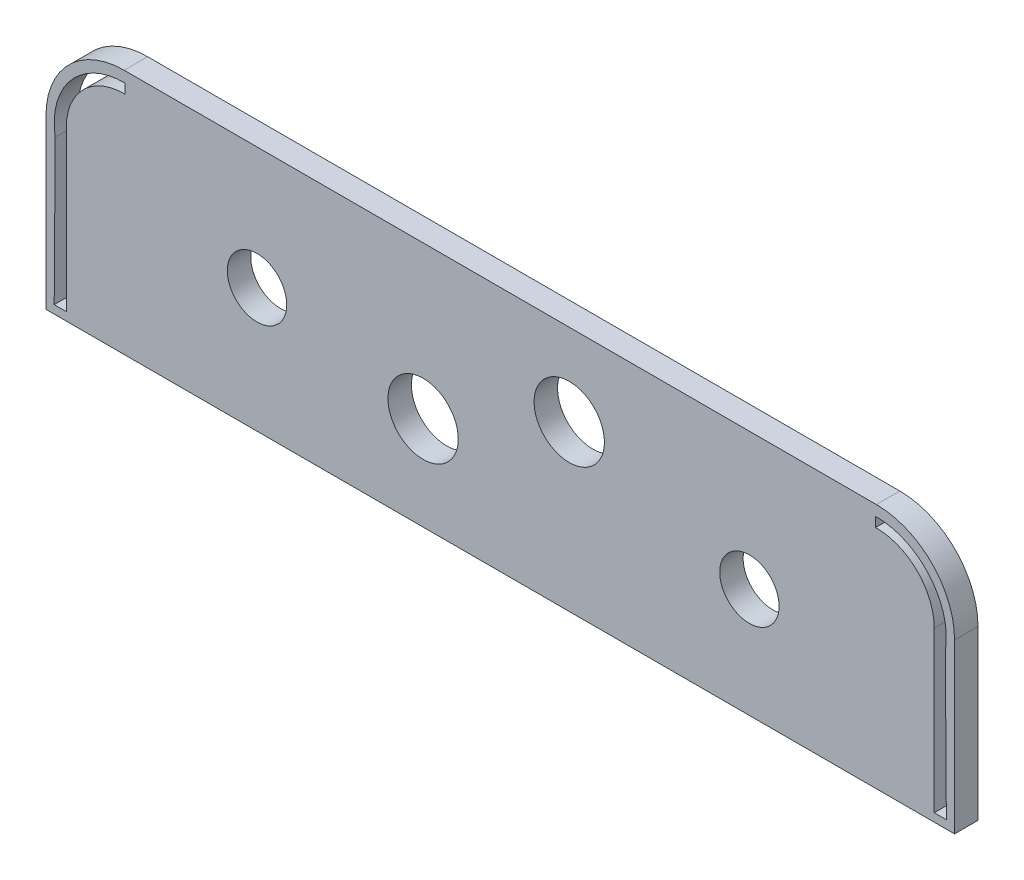
ISO-10303-21;
HEADER;
FILE_DESCRIPTION(('STEP AP214'),'2;1');
FILE_NAME('part.step','',(''),(''),'','','');
FILE_SCHEMA(('AUTOMOTIVE_DESIGN { 1 0 10303 214 1 1 1 1 }'));
ENDSEC;
DATA;
#1=APPLICATION_CONTEXT('core data for automotive mechanical design processes');
#2=APPLICATION_PROTOCOL_DEFINITION('international standard','automotive_design',2000,#1);
#3=PRODUCT_CONTEXT('',#1,'mechanical');
#4=PRODUCT('Part','Part','',(#3));
#5=PRODUCT_RELATED_PRODUCT_CATEGORY('part','',(#4));
#6=PRODUCT_DEFINITION_FORMATION('','',#4);
#7=PRODUCT_DEFINITION_CONTEXT('part definition',#1,'design');
#8=PRODUCT_DEFINITION('design','',#6,#7);
#9=PRODUCT_DEFINITION_SHAPE('','',#8);
#10=(LENGTH_UNIT() NAMED_UNIT(*) SI_UNIT(.MILLI.,.METRE.));
#11=(NAMED_UNIT(*) PLANE_ANGLE_UNIT() SI_UNIT($,.RADIAN.));
#12=(NAMED_UNIT(*) SI_UNIT($,.STERADIAN.) SOLID_ANGLE_UNIT());
#13=UNCERTAINTY_MEASURE_WITH_UNIT(LENGTH_MEASURE(1.E-05),#10,'distance_accuracy_value','');
#14=(GEOMETRIC_REPRESENTATION_CONTEXT(3) GLOBAL_UNCERTAINTY_ASSIGNED_CONTEXT((#13)) GLOBAL_UNIT_ASSIGNED_CONTEXT((#10,
#11,#12)) REPRESENTATION_CONTEXT('',''));
#15=CARTESIAN_POINT('',(0.,0.,0.));
#16=DIRECTION('',(0.,0.,1.));
#17=DIRECTION('',(1.,0.,0.));
#18=AXIS2_PLACEMENT_3D('',#15,#16,#17);
#19=CARTESIAN_POINT('',(58.125,5.75,3.));
#20=DIRECTION('',(-1.,0.,0.));
#21=DIRECTION('',(0.,-1.,0.));
#22=AXIS2_PLACEMENT_3D('',#19,#20,#21);
#23=PLANE('',#22);
#24=DIRECTION('',(0.,-1.,0.));
#25=VECTOR('',#24,1.);
#26=CARTESIAN_POINT('',(58.125,-15.75,3.));
#27=LINE('',#26,#25);
#28=CARTESIAN_POINT('',(58.125,5.74999999999999,3.));
#29=VERTEX_POINT('',#28);
#30=CARTESIAN_POINT('',(58.125,-15.75,3.));
#31=VERTEX_POINT('',#30);
#32=EDGE_CURVE('E365',#29,#31,#27,.T.);
#33=ORIENTED_EDGE('',*,*,#32,.T.);
#34=DIRECTION('',(0.,0.,-1.));
#35=VECTOR('',#34,1.);
#36=CARTESIAN_POINT('',(58.125,-15.75,3.));
#37=LINE('',#36,#35);
#38=CARTESIAN_POINT('',(58.125,-15.75,0.));
#39=VERTEX_POINT('',#38);
#40=EDGE_CURVE('E265',#31,#39,#37,.T.);
#41=ORIENTED_EDGE('',*,*,#40,.T.);
#42=DIRECTION('',(0.,1.,0.));
#43=VECTOR('',#42,1.);
#44=CARTESIAN_POINT('',(58.125,5.75,0.));
#45=LINE('',#44,#43);
#46=CARTESIAN_POINT('',(58.125,5.75,0.));
#47=VERTEX_POINT('',#46);
#48=EDGE_CURVE('E256',#39,#47,#45,.T.);
#49=ORIENTED_EDGE('',*,*,#48,.T.);
#50=DIRECTION('',(0.,0.,-1.));
#51=VECTOR('',#50,1.);
#52=CARTESIAN_POINT('',(58.125,5.75,3.));
#53=LINE('',#52,#51);
#54=EDGE_CURVE('E291',#29,#47,#53,.T.);
#55=ORIENTED_EDGE('',*,*,#54,.F.);
#56=EDGE_LOOP('',(#33,#41,#49,#55));
#57=FACE_BOUND('',#56,.T.);
#58=ADVANCED_FACE('F41',(#57),#23,.F.);
#59=CARTESIAN_POINT('',(48.125,5.75,3.));
#60=DIRECTION('',(0.,0.,-1.));
#61=DIRECTION('',(-1.,0.,0.));
#62=AXIS2_PLACEMENT_3D('',#59,#60,#61);
#63=CYLINDRICAL_SURFACE('',#62,10.);
#64=CARTESIAN_POINT('',(48.125,5.75,3.));
#65=DIRECTION('',(0.,0.,1.));
#66=DIRECTION('',(1.,0.,0.));
#67=AXIS2_PLACEMENT_3D('',#64,#65,#66);
#68=CIRCLE('',#67,10.);
#69=CARTESIAN_POINT('',(48.125,15.75,3.));
#70=VERTEX_POINT('',#69);
#71=EDGE_CURVE('E187',#70,#29,#68,.F.);
#72=ORIENTED_EDGE('',*,*,#71,.T.);
#73=ORIENTED_EDGE('',*,*,#54,.T.);
#74=CARTESIAN_POINT('',(48.125,5.75,0.));
#75=DIRECTION('',(0.,0.,1.));
#76=DIRECTION('',(-1.,0.,0.));
#77=AXIS2_PLACEMENT_3D('',#74,#75,#76);
#78=CIRCLE('',#77,10.);
#79=CARTESIAN_POINT('',(48.125,15.75,0.));
#80=VERTEX_POINT('',#79);
#81=EDGE_CURVE('E268',#47,#80,#78,.T.);
#82=ORIENTED_EDGE('',*,*,#81,.T.);
#83=DIRECTION('',(0.,0.,-1.));
#84=VECTOR('',#83,1.);
#85=CARTESIAN_POINT('',(48.125,15.75,3.));
#86=LINE('',#85,#84);
#87=EDGE_CURVE('E288',#70,#80,#86,.T.);
#88=ORIENTED_EDGE('',*,*,#87,.F.);
#89=EDGE_LOOP('',(#72,#73,#82,#88));
#90=FACE_BOUND('',#89,.T.);
#91=ADVANCED_FACE('F355',(#90),#63,.T.);
#92=CARTESIAN_POINT('',(-48.125,5.75,3.));
#93=DIRECTION('',(0.,0.,-1.));
#94=DIRECTION('',(-1.,0.,0.));
#95=AXIS2_PLACEMENT_3D('',#92,#93,#94);
#96=CYLINDRICAL_SURFACE('',#95,10.);
#97=CARTESIAN_POINT('',(-48.125,5.75,3.));
#98=DIRECTION('',(0.,0.,1.));
#99=DIRECTION('',(1.,0.,0.));
#100=AXIS2_PLACEMENT_3D('',#97,#98,#99);
#101=CIRCLE('',#100,10.);
#102=CARTESIAN_POINT('',(-58.125,5.75,3.));
#103=VERTEX_POINT('',#102);
#104=CARTESIAN_POINT('',(-48.125,15.75,3.));
#105=VERTEX_POINT('',#104);
#106=EDGE_CURVE('E317',#103,#105,#101,.F.);
#107=ORIENTED_EDGE('',*,*,#106,.T.);
#108=DIRECTION('',(0.,0.,-1.));
#109=VECTOR('',#108,1.);
#110=CARTESIAN_POINT('',(-48.125,15.75,3.));
#111=LINE('',#110,#109);
#112=CARTESIAN_POINT('',(-48.125,15.75,0.));
#113=VERTEX_POINT('',#112);
#114=EDGE_CURVE('E285',#105,#113,#111,.T.);
#115=ORIENTED_EDGE('',*,*,#114,.T.);
#116=CARTESIAN_POINT('',(-48.125,5.75,0.));
#117=DIRECTION('',(0.,0.,1.));
#118=DIRECTION('',(1.,0.,0.));
#119=AXIS2_PLACEMENT_3D('',#116,#117,#118);
#120=CIRCLE('',#119,10.);
#121=CARTESIAN_POINT('',(-58.125,5.75,0.));
#122=VERTEX_POINT('',#121);
#123=EDGE_CURVE('E272',#113,#122,#120,.T.);
#124=ORIENTED_EDGE('',*,*,#123,.T.);
#125=DIRECTION('',(0.,0.,-1.));
#126=VECTOR('',#125,1.);
#127=CARTESIAN_POINT('',(-58.125,5.75,3.));
#128=LINE('',#127,#126);
#129=EDGE_CURVE('E283',#103,#122,#128,.T.);
#130=ORIENTED_EDGE('',*,*,#129,.F.);
#131=EDGE_LOOP('',(#107,#115,#124,#130));
#132=FACE_BOUND('',#131,.T.);
#133=ADVANCED_FACE('F361',(#132),#96,.T.);
#134=CARTESIAN_POINT('',(-58.125,5.75,3.));
#135=DIRECTION('',(1.,0.,0.));
#136=DIRECTION('',(0.,0.,-1.));
#137=AXIS2_PLACEMENT_3D('',#134,#135,#136);
#138=PLANE('',#137);
#139=DIRECTION('',(0.,1.,0.));
#140=VECTOR('',#139,1.);
#141=CARTESIAN_POINT('',(-58.125,5.75,3.));
#142=LINE('',#141,#140);
#143=CARTESIAN_POINT('',(-58.125,-15.75,3.));
#144=VERTEX_POINT('',#143);
#145=EDGE_CURVE('E391',#144,#103,#142,.T.);
#146=ORIENTED_EDGE('',*,*,#145,.T.);
#147=ORIENTED_EDGE('',*,*,#129,.T.);
#148=DIRECTION('',(0.,-1.,0.));
#149=VECTOR('',#148,1.);
#150=CARTESIAN_POINT('',(-58.125,5.75,0.));
#151=LINE('',#150,#149);
#152=CARTESIAN_POINT('',(-58.125,-15.75,0.));
#153=VERTEX_POINT('',#152);
#154=EDGE_CURVE('E275',#122,#153,#151,.T.);
#155=ORIENTED_EDGE('',*,*,#154,.T.);
#156=DIRECTION('',(0.,0.,-1.));
#157=VECTOR('',#156,1.);
#158=CARTESIAN_POINT('',(-58.125,-15.75,3.));
#159=LINE('',#158,#157);
#160=EDGE_CURVE('E281',#144,#153,#159,.T.);
#161=ORIENTED_EDGE('',*,*,#160,.F.);
#162=EDGE_LOOP('',(#146,#147,#155,#161));
#163=FACE_BOUND('',#162,.T.);
#164=ADVANCED_FACE('F395',(#163),#138,.F.);
#165=CARTESIAN_POINT('',(-58.125,-15.75,3.));
#166=DIRECTION('',(0.,1.,0.));
#167=DIRECTION('',(0.,0.,1.));
#168=AXIS2_PLACEMENT_3D('',#165,#166,#167);
#169=PLANE('',#168);
#170=ORIENTED_EDGE('',*,*,#40,.F.);
#171=DIRECTION('',(1.,0.,0.));
#172=VECTOR('',#171,1.);
#173=CARTESIAN_POINT('',(-58.125,-15.75,3.));
#174=LINE('',#173,#172);
#175=EDGE_CURVE('E262',#144,#31,#174,.T.);
#176=ORIENTED_EDGE('',*,*,#175,.F.);
#177=ORIENTED_EDGE('',*,*,#160,.T.);
#178=DIRECTION('',(1.,0.,0.));
#179=VECTOR('',#178,1.);
#180=CARTESIAN_POINT('',(-58.125,-15.75,0.));
#181=LINE('',#180,#179);
#182=EDGE_CURVE('E263',#153,#39,#181,.T.);
#183=ORIENTED_EDGE('',*,*,#182,.T.);
#184=EDGE_LOOP('',(#170,#176,#177,#183));
#185=FACE_BOUND('',#184,.T.);
#186=ADVANCED_FACE('F370',(#185),#169,.F.);
#187=CARTESIAN_POINT('',(-48.125,5.4351898188413,-22.));
#188=DIRECTION('',(0.,0.,1.));
#189=DIRECTION('',(1.,0.,0.));
#190=AXIS2_PLACEMENT_3D('',#187,#188,#189);
#191=CYLINDRICAL_SURFACE('',#190,8.95);
#192=CARTESIAN_POINT('',(-48.125,5.4351898188413,3.));
#193=DIRECTION('',(0.,0.,1.));
#194=DIRECTION('',(1.,0.,0.));
#195=AXIS2_PLACEMENT_3D('',#192,#193,#194);
#196=CIRCLE('',#195,8.95);
#197=CARTESIAN_POINT('',(-48.025,14.3846311421866,3.));
#198=VERTEX_POINT('',#197);
#199=CARTESIAN_POINT('',(-56.946937757455,3.92657648084162,3.));
#200=VERTEX_POINT('',#199);
#201=EDGE_CURVE('E224',#198,#200,#196,.T.);
#202=ORIENTED_EDGE('',*,*,#201,.T.);
#203=DIRECTION('',(0.,0.,1.));
#204=VECTOR('',#203,1.);
#205=CARTESIAN_POINT('',(-56.946937757455,3.92657648084162,-22.));
#206=LINE('',#205,#204);
#207=CARTESIAN_POINT('',(-56.946937757455,3.92657648084162,0.));
#208=VERTEX_POINT('',#207);
#209=EDGE_CURVE('E193',#208,#200,#206,.T.);
#210=ORIENTED_EDGE('',*,*,#209,.F.);
#211=CARTESIAN_POINT('',(-48.125,5.4351898188413,0.));
#212=DIRECTION('',(0.,0.,1.));
#213=DIRECTION('',(1.,0.,0.));
#214=AXIS2_PLACEMENT_3D('',#211,#212,#213);
#215=CIRCLE('',#214,8.95);
#216=CARTESIAN_POINT('',(-48.025,14.3846311421866,0.));
#217=VERTEX_POINT('',#216);
#218=EDGE_CURVE('E226',#217,#208,#215,.T.);
#219=ORIENTED_EDGE('',*,*,#218,.F.);
#220=DIRECTION('',(0.,0.,1.));
#221=VECTOR('',#220,1.);
#222=CARTESIAN_POINT('',(-48.025,14.3846311421866,-22.));
#223=LINE('',#222,#221);
#224=EDGE_CURVE('E213',#217,#198,#223,.T.);
#225=ORIENTED_EDGE('',*,*,#224,.T.);
#226=EDGE_LOOP('',(#202,#210,#219,#225));
#227=FACE_BOUND('',#226,.T.);
#228=ADVANCED_FACE('F402',(#227),#191,.F.);
#229=CARTESIAN_POINT('',(-55.525,-14.7,-22.));
#230=DIRECTION('',(0.,-1.,0.));
#231=DIRECTION('',(0.,0.,-1.));
#232=AXIS2_PLACEMENT_3D('',#229,#230,#231);
#233=PLANE('',#232);
#234=DIRECTION('',(0.,0.,1.));
#235=VECTOR('',#234,1.);
#236=CARTESIAN_POINT('',(-57.0756936373201,-14.7,-22.));
#237=LINE('',#236,#235);
#238=CARTESIAN_POINT('',(-57.0756936373201,-14.7,0.));
#239=VERTEX_POINT('',#238);
#240=CARTESIAN_POINT('',(-57.0756936373201,-14.7,3.));
#241=VERTEX_POINT('',#240);
#242=EDGE_CURVE('E198',#239,#241,#237,.T.);
#243=ORIENTED_EDGE('',*,*,#242,.T.);
#244=DIRECTION('',(1.,0.,0.));
#245=VECTOR('',#244,1.);
#246=CARTESIAN_POINT('',(-48.125,-14.7,3.));
#247=LINE('',#246,#245);
#248=CARTESIAN_POINT('',(-55.525,-14.7,3.));
#249=VERTEX_POINT('',#248);
#250=EDGE_CURVE('E57',#241,#249,#247,.T.);
#251=ORIENTED_EDGE('',*,*,#250,.T.);
#252=DIRECTION('',(0.,0.,1.));
#253=VECTOR('',#252,1.);
#254=CARTESIAN_POINT('',(-55.525,-14.7,-22.));
#255=LINE('',#254,#253);
#256=CARTESIAN_POINT('',(-55.525,-14.7,0.));
#257=VERTEX_POINT('',#256);
#258=EDGE_CURVE('E204',#257,#249,#255,.T.);
#259=ORIENTED_EDGE('',*,*,#258,.F.);
#260=DIRECTION('',(1.,0.,0.));
#261=VECTOR('',#260,1.);
#262=CARTESIAN_POINT('',(-48.125,-14.7,0.));
#263=LINE('',#262,#261);
#264=EDGE_CURVE('E221',#239,#257,#263,.T.);
#265=ORIENTED_EDGE('',*,*,#264,.F.);
#266=EDGE_LOOP('',(#243,#251,#259,#265));
#267=FACE_BOUND('',#266,.T.);
#268=ADVANCED_FACE('F439',(#267),#233,.F.);
#269=CARTESIAN_POINT('',(-56.946937757455,3.92657648084162,-22.));
#270=DIRECTION('',(-0.999976109650513,0.00691231713860811,0.));
#271=DIRECTION('',(-0.00691231713860811,-0.999976109650513,0.));
#272=AXIS2_PLACEMENT_3D('',#269,#270,#271);
#273=PLANE('',#272);
#274=DIRECTION('',(-0.00691231713860811,-0.999976109650513,0.));
#275=VECTOR('',#274,1.);
#276=CARTESIAN_POINT('',(-57.0756936373201,-14.7,3.));
#277=LINE('',#276,#275);
#278=EDGE_CURVE('E390',#200,#241,#277,.T.);
#279=ORIENTED_EDGE('',*,*,#278,.T.);
#280=ORIENTED_EDGE('',*,*,#242,.F.);
#281=DIRECTION('',(-0.00691231713860811,-0.999976109650513,0.));
#282=VECTOR('',#281,1.);
#283=CARTESIAN_POINT('',(-56.9339124636112,5.81089145131277,0.));
#284=LINE('',#283,#282);
#285=EDGE_CURVE('E217',#208,#239,#284,.T.);
#286=ORIENTED_EDGE('',*,*,#285,.F.);
#287=ORIENTED_EDGE('',*,*,#209,.T.);
#288=EDGE_LOOP('',(#279,#280,#286,#287));
#289=FACE_BOUND('',#288,.T.);
#290=ADVANCED_FACE('F351',(#289),#273,.F.);
#291=CARTESIAN_POINT('',(55.525,-14.7,-22.));
#292=DIRECTION('',(0.,-1.,0.));
#293=DIRECTION('',(0.,0.,-1.));
#294=AXIS2_PLACEMENT_3D('',#291,#292,#293);
#295=PLANE('',#294);
#296=DIRECTION('',(1.,0.,0.));
#297=VECTOR('',#296,1.);
#298=CARTESIAN_POINT('',(-48.125,-14.7,3.));
#299=LINE('',#298,#297);
#300=CARTESIAN_POINT('',(55.525,-14.7,3.));
#301=VERTEX_POINT('',#300);
#302=CARTESIAN_POINT('',(57.0756936373201,-14.7,3.));
#303=VERTEX_POINT('',#302);
#304=EDGE_CURVE('E170',#301,#303,#299,.T.);
#305=ORIENTED_EDGE('',*,*,#304,.T.);
#306=DIRECTION('',(0.,0.,1.));
#307=VECTOR('',#306,1.);
#308=CARTESIAN_POINT('',(57.0756936373201,-14.7,-22.));
#309=LINE('',#308,#307);
#310=CARTESIAN_POINT('',(57.0756936373201,-14.7,0.));
#311=VERTEX_POINT('',#310);
#312=EDGE_CURVE('E173',#311,#303,#309,.T.);
#313=ORIENTED_EDGE('',*,*,#312,.F.);
#314=DIRECTION('',(1.,0.,0.));
#315=VECTOR('',#314,1.);
#316=CARTESIAN_POINT('',(-48.125,-14.7,0.));
#317=LINE('',#316,#315);
#318=CARTESIAN_POINT('',(55.525,-14.7,0.));
#319=VERTEX_POINT('',#318);
#320=EDGE_CURVE('E178',#319,#311,#317,.T.);
#321=ORIENTED_EDGE('',*,*,#320,.F.);
#322=DIRECTION('',(0.,0.,1.));
#323=VECTOR('',#322,1.);
#324=CARTESIAN_POINT('',(55.525,-14.7,-22.));
#325=LINE('',#324,#323);
#326=EDGE_CURVE('E176',#319,#301,#325,.T.);
#327=ORIENTED_EDGE('',*,*,#326,.T.);
#328=EDGE_LOOP('',(#305,#313,#321,#327));
#329=FACE_BOUND('',#328,.T.);
#330=ADVANCED_FACE('F171',(#329),#295,.F.);
#331=CARTESIAN_POINT('',(48.125,5.43518981884131,-22.));
#332=DIRECTION('',(0.,0.,1.));
#333=DIRECTION('',(1.,0.,0.));
#334=AXIS2_PLACEMENT_3D('',#331,#332,#333);
#335=CYLINDRICAL_SURFACE('',#334,8.95);
#336=DIRECTION('',(0.,0.,1.));
#337=VECTOR('',#336,1.);
#338=CARTESIAN_POINT('',(56.946937757455,3.92657648084163,-22.));
#339=LINE('',#338,#337);
#340=CARTESIAN_POINT('',(56.946937757455,3.92657648084163,0.));
#341=VERTEX_POINT('',#340);
#342=CARTESIAN_POINT('',(56.946937757455,3.92657648084163,3.));
#343=VERTEX_POINT('',#342);
#344=EDGE_CURVE('E192',#341,#343,#339,.T.);
#345=ORIENTED_EDGE('',*,*,#344,.T.);
#346=CARTESIAN_POINT('',(48.125,5.43518981884131,3.));
#347=DIRECTION('',(0.,0.,1.));
#348=DIRECTION('',(1.,0.,0.));
#349=AXIS2_PLACEMENT_3D('',#346,#347,#348);
#350=CIRCLE('',#349,8.95);
#351=CARTESIAN_POINT('',(48.025,14.3846311421866,3.));
#352=VERTEX_POINT('',#351);
#353=EDGE_CURVE('E65',#343,#352,#350,.T.);
#354=ORIENTED_EDGE('',*,*,#353,.T.);
#355=DIRECTION('',(0.,0.,1.));
#356=VECTOR('',#355,1.);
#357=CARTESIAN_POINT('',(48.025,14.3846311421866,-22.));
#358=LINE('',#357,#356);
#359=CARTESIAN_POINT('',(48.025,14.3846311421866,0.));
#360=VERTEX_POINT('',#359);
#361=EDGE_CURVE('E195',#360,#352,#358,.T.);
#362=ORIENTED_EDGE('',*,*,#361,.F.);
#363=CARTESIAN_POINT('',(48.125,5.43518981884131,0.));
#364=DIRECTION('',(0.,0.,1.));
#365=DIRECTION('',(1.,0.,0.));
#366=AXIS2_PLACEMENT_3D('',#363,#364,#365);
#367=CIRCLE('',#366,8.95);
#368=EDGE_CURVE('E179',#341,#360,#367,.T.);
#369=ORIENTED_EDGE('',*,*,#368,.F.);
#370=EDGE_LOOP('',(#345,#354,#362,#369));
#371=FACE_BOUND('',#370,.T.);
#372=ADVANCED_FACE('F343',(#371),#335,.F.);
#373=CARTESIAN_POINT('',(56.946937757455,3.92657648084163,-22.));
#374=DIRECTION('',(0.999976109650513,0.00691231713860886,0.));
#375=DIRECTION('',(-0.00691231713860886,0.999976109650513,0.));
#376=AXIS2_PLACEMENT_3D('',#373,#374,#375);
#377=PLANE('',#376);
#378=DIRECTION('',(-0.00691231713860923,0.999976109650513,0.));
#379=VECTOR('',#378,1.);
#380=CARTESIAN_POINT('',(56.946937757455,3.92657648084163,3.));
#381=LINE('',#380,#379);
#382=EDGE_CURVE('E181',#303,#343,#381,.T.);
#383=ORIENTED_EDGE('',*,*,#382,.T.);
#384=ORIENTED_EDGE('',*,*,#344,.F.);
#385=DIRECTION('',(-0.00691231713860886,0.999976109650513,0.));
#386=VECTOR('',#385,1.);
#387=CARTESIAN_POINT('',(56.9293136262696,6.47618608140293,0.));
#388=LINE('',#387,#386);
#389=EDGE_CURVE('E191',#311,#341,#388,.T.);
#390=ORIENTED_EDGE('',*,*,#389,.F.);
#391=ORIENTED_EDGE('',*,*,#312,.T.);
#392=EDGE_LOOP('',(#383,#384,#390,#391));
#393=FACE_BOUND('',#392,.T.);
#394=ADVANCED_FACE('F189',(#393),#377,.F.);
#395=CARTESIAN_POINT('',(-48.125,5.75,3.));
#396=DIRECTION('',(0.,0.,1.));
#397=DIRECTION('',(1.,0.,0.));
#398=AXIS2_PLACEMENT_3D('',#395,#396,#397);
#399=PLANE('',#398);
#400=ORIENTED_EDGE('',*,*,#382,.F.);
#401=ORIENTED_EDGE('',*,*,#304,.F.);
#402=DIRECTION('',(0.,-1.,0.));
#403=VECTOR('',#402,1.);
#404=CARTESIAN_POINT('',(55.525,5.75,3.));
#405=LINE('',#404,#403);
#406=CARTESIAN_POINT('',(55.525,5.75000000000001,3.));
#407=VERTEX_POINT('',#406);
#408=EDGE_CURVE('E244',#407,#301,#405,.T.);
#409=ORIENTED_EDGE('',*,*,#408,.F.);
#410=CARTESIAN_POINT('',(48.125,5.75000000000001,3.));
#411=DIRECTION('',(0.,0.,1.));
#412=DIRECTION('',(1.,0.,0.));
#413=AXIS2_PLACEMENT_3D('',#410,#411,#412);
#414=CIRCLE('',#413,7.40000000000001);
#415=CARTESIAN_POINT('',(48.025,13.1493242934744,3.));
#416=VERTEX_POINT('',#415);
#417=EDGE_CURVE('E242',#416,#407,#414,.F.);
#418=ORIENTED_EDGE('',*,*,#417,.F.);
#419=DIRECTION('',(0.,-1.,0.));
#420=VECTOR('',#419,1.);
#421=CARTESIAN_POINT('',(48.025,5.75,3.));
#422=LINE('',#421,#420);
#423=EDGE_CURVE('E240',#352,#416,#422,.T.);
#424=ORIENTED_EDGE('',*,*,#423,.F.);
#425=ORIENTED_EDGE('',*,*,#353,.F.);
#426=EDGE_LOOP('',(#400,#401,#409,#418,#424,#425));
#427=FACE_BOUND('',#426,.T.);
#428=DIRECTION('',(-1.,0.,0.));
#429=VECTOR('',#428,1.);
#430=CARTESIAN_POINT('',(-48.125,15.75,3.));
#431=LINE('',#430,#429);
#432=EDGE_CURVE('E259',#70,#105,#431,.T.);
#433=ORIENTED_EDGE('',*,*,#432,.T.);
#434=ORIENTED_EDGE('',*,*,#106,.F.);
#435=ORIENTED_EDGE('',*,*,#145,.F.);
#436=ORIENTED_EDGE('',*,*,#175,.T.);
#437=ORIENTED_EDGE('',*,*,#32,.F.);
#438=ORIENTED_EDGE('',*,*,#71,.F.);
#439=EDGE_LOOP('',(#433,#434,#435,#436,#437,#438));
#440=FACE_BOUND('',#439,.T.);
#441=CARTESIAN_POINT('',(-9.87500000000002,-3.75,3.));
#442=DIRECTION('',(0.,0.,1.));
#443=DIRECTION('',(1.,0.,0.));
#444=AXIS2_PLACEMENT_3D('',#441,#442,#443);
#445=CIRCLE('',#444,4.5);
#446=CARTESIAN_POINT('',(-5.37500000000002,-3.75,3.));
#447=VERTEX_POINT('',#446);
#448=EDGE_CURVE('E216',#447,#447,#445,.T.);
#449=ORIENTED_EDGE('',*,*,#448,.F.);
#450=EDGE_LOOP('',(#449));
#451=FACE_BOUND('',#450,.T.);
#452=CARTESIAN_POINT('',(8.82499999999998,5.25,3.));
#453=DIRECTION('',(0.,0.,1.));
#454=DIRECTION('',(1.,0.,0.));
#455=AXIS2_PLACEMENT_3D('',#452,#453,#454);
#456=CIRCLE('',#455,4.5);
#457=CARTESIAN_POINT('',(13.325,5.25,3.));
#458=VERTEX_POINT('',#457);
#459=EDGE_CURVE('E307',#458,#458,#456,.T.);
#460=ORIENTED_EDGE('',*,*,#459,.F.);
#461=EDGE_LOOP('',(#460));
#462=FACE_BOUND('',#461,.T.);
#463=ORIENTED_EDGE('',*,*,#278,.F.);
#464=ORIENTED_EDGE('',*,*,#201,.F.);
#465=DIRECTION('',(0.,1.,0.));
#466=VECTOR('',#465,1.);
#467=CARTESIAN_POINT('',(-48.025,5.75,3.));
#468=LINE('',#467,#466);
#469=CARTESIAN_POINT('',(-48.025,13.1493242934744,3.));
#470=VERTEX_POINT('',#469);
#471=EDGE_CURVE('E238',#470,#198,#468,.T.);
#472=ORIENTED_EDGE('',*,*,#471,.F.);
#473=CARTESIAN_POINT('',(-48.125,5.75,3.));
#474=DIRECTION('',(0.,0.,1.));
#475=DIRECTION('',(1.,0.,0.));
#476=AXIS2_PLACEMENT_3D('',#473,#474,#475);
#477=CIRCLE('',#476,7.4);
#478=CARTESIAN_POINT('',(-55.525,5.75,3.));
#479=VERTEX_POINT('',#478);
#480=EDGE_CURVE('E236',#479,#470,#477,.F.);
#481=ORIENTED_EDGE('',*,*,#480,.F.);
#482=DIRECTION('',(0.,1.,0.));
#483=VECTOR('',#482,1.);
#484=CARTESIAN_POINT('',(-55.525,5.75,3.));
#485=LINE('',#484,#483);
#486=EDGE_CURVE('E234',#249,#479,#485,.T.);
#487=ORIENTED_EDGE('',*,*,#486,.F.);
#488=ORIENTED_EDGE('',*,*,#250,.F.);
#489=EDGE_LOOP('',(#463,#464,#472,#481,#487,#488));
#490=FACE_BOUND('',#489,.T.);
#491=CARTESIAN_POINT('',(31.875,-1.75000000000001,3.));
#492=DIRECTION('',(0.,0.,1.));
#493=DIRECTION('',(1.,0.,0.));
#494=AXIS2_PLACEMENT_3D('',#491,#492,#493);
#495=CIRCLE('',#494,3.79999999999998);
#496=CARTESIAN_POINT('',(35.675,-1.75000000000001,3.));
#497=VERTEX_POINT('',#496);
#498=EDGE_CURVE('E253',#497,#497,#495,.T.);
#499=ORIENTED_EDGE('',*,*,#498,.F.);
#500=EDGE_LOOP('',(#499));
#501=FACE_BOUND('',#500,.T.);
#502=CARTESIAN_POINT('',(-31.125,0.149999999999997,3.));
#503=DIRECTION('',(0.,0.,1.));
#504=DIRECTION('',(1.,0.,0.));
#505=AXIS2_PLACEMENT_3D('',#502,#503,#504);
#506=CIRCLE('',#505,3.8);
#507=CARTESIAN_POINT('',(-27.325,0.149999999999997,3.));
#508=VERTEX_POINT('',#507);
#509=EDGE_CURVE('E247',#508,#508,#506,.T.);
#510=ORIENTED_EDGE('',*,*,#509,.F.);
#511=EDGE_LOOP('',(#510));
#512=FACE_BOUND('',#511,.T.);
#513=ADVANCED_FACE('F182',(#427,#440,#451,#462,#490,#501,#512),#399,.T.);
#514=CARTESIAN_POINT('',(-48.125,5.75,0.));
#515=DIRECTION('',(0.,0.,1.));
#516=DIRECTION('',(1.,0.,0.));
#517=AXIS2_PLACEMENT_3D('',#514,#515,#516);
#518=PLANE('',#517);
#519=CARTESIAN_POINT('',(-9.87500000000002,-3.75,0.));
#520=DIRECTION('',(0.,0.,1.));
#521=DIRECTION('',(1.,0.,0.));
#522=AXIS2_PLACEMENT_3D('',#519,#520,#521);
#523=CIRCLE('',#522,4.5);
#524=CARTESIAN_POINT('',(-5.37500000000002,-3.75,0.));
#525=VERTEX_POINT('',#524);
#526=EDGE_CURVE('E44',#525,#525,#523,.T.);
#527=ORIENTED_EDGE('',*,*,#526,.T.);
#528=EDGE_LOOP('',(#527));
#529=FACE_BOUND('',#528,.T.);
#530=CARTESIAN_POINT('',(8.82499999999998,5.25,0.));
#531=DIRECTION('',(0.,0.,1.));
#532=DIRECTION('',(1.,0.,0.));
#533=AXIS2_PLACEMENT_3D('',#530,#531,#532);
#534=CIRCLE('',#533,4.5);
#535=CARTESIAN_POINT('',(13.325,5.25,0.));
#536=VERTEX_POINT('',#535);
#537=EDGE_CURVE('E186',#536,#536,#534,.T.);
#538=ORIENTED_EDGE('',*,*,#537,.T.);
#539=EDGE_LOOP('',(#538));
#540=FACE_BOUND('',#539,.T.);
#541=DIRECTION('',(0.,-1.,0.));
#542=VECTOR('',#541,1.);
#543=CARTESIAN_POINT('',(55.525,5.75,0.));
#544=LINE('',#543,#542);
#545=CARTESIAN_POINT('',(55.525,5.75000000000001,0.));
#546=VERTEX_POINT('',#545);
#547=EDGE_CURVE('E11',#546,#319,#544,.T.);
#548=ORIENTED_EDGE('',*,*,#547,.T.);
#549=ORIENTED_EDGE('',*,*,#320,.T.);
#550=ORIENTED_EDGE('',*,*,#389,.T.);
#551=ORIENTED_EDGE('',*,*,#368,.T.);
#552=DIRECTION('',(0.,-1.,0.));
#553=VECTOR('',#552,1.);
#554=CARTESIAN_POINT('',(48.025,5.75,0.));
#555=LINE('',#554,#553);
#556=CARTESIAN_POINT('',(48.025,13.1493242934744,0.));
#557=VERTEX_POINT('',#556);
#558=EDGE_CURVE('E302',#360,#557,#555,.T.);
#559=ORIENTED_EDGE('',*,*,#558,.T.);
#560=CARTESIAN_POINT('',(48.125,5.75000000000001,0.));
#561=DIRECTION('',(0.,0.,1.));
#562=DIRECTION('',(1.,0.,0.));
#563=AXIS2_PLACEMENT_3D('',#560,#561,#562);
#564=CIRCLE('',#563,7.40000000000001);
#565=EDGE_CURVE('E49',#557,#546,#564,.F.);
#566=ORIENTED_EDGE('',*,*,#565,.T.);
#567=EDGE_LOOP('',(#548,#549,#550,#551,#559,#566));
#568=FACE_BOUND('',#567,.T.);
#569=DIRECTION('',(0.,1.,0.));
#570=VECTOR('',#569,1.);
#571=CARTESIAN_POINT('',(-48.025,5.75,0.));
#572=LINE('',#571,#570);
#573=CARTESIAN_POINT('',(-48.025,13.1493242934744,0.));
#574=VERTEX_POINT('',#573);
#575=EDGE_CURVE('E299',#574,#217,#572,.T.);
#576=ORIENTED_EDGE('',*,*,#575,.T.);
#577=ORIENTED_EDGE('',*,*,#218,.T.);
#578=ORIENTED_EDGE('',*,*,#285,.T.);
#579=ORIENTED_EDGE('',*,*,#264,.T.);
#580=DIRECTION('',(0.,1.,0.));
#581=VECTOR('',#580,1.);
#582=CARTESIAN_POINT('',(-55.525,5.75,0.));
#583=LINE('',#582,#581);
#584=CARTESIAN_POINT('',(-55.525,5.75,0.));
#585=VERTEX_POINT('',#584);
#586=EDGE_CURVE('E293',#257,#585,#583,.T.);
#587=ORIENTED_EDGE('',*,*,#586,.T.);
#588=CARTESIAN_POINT('',(-48.125,5.75,0.));
#589=DIRECTION('',(0.,0.,1.));
#590=DIRECTION('',(1.,0.,0.));
#591=AXIS2_PLACEMENT_3D('',#588,#589,#590);
#592=CIRCLE('',#591,7.4);
#593=EDGE_CURVE('E296',#585,#574,#592,.F.);
#594=ORIENTED_EDGE('',*,*,#593,.T.);
#595=EDGE_LOOP('',(#576,#577,#578,#579,#587,#594));
#596=FACE_BOUND('',#595,.T.);
#597=ORIENTED_EDGE('',*,*,#48,.F.);
#598=ORIENTED_EDGE('',*,*,#182,.F.);
#599=ORIENTED_EDGE('',*,*,#154,.F.);
#600=ORIENTED_EDGE('',*,*,#123,.F.);
#601=DIRECTION('',(-1.,0.,0.));
#602=VECTOR('',#601,1.);
#603=CARTESIAN_POINT('',(-48.125,15.75,0.));
#604=LINE('',#603,#602);
#605=EDGE_CURVE('E270',#80,#113,#604,.T.);
#606=ORIENTED_EDGE('',*,*,#605,.F.);
#607=ORIENTED_EDGE('',*,*,#81,.F.);
#608=EDGE_LOOP('',(#597,#598,#599,#600,#606,#607));
#609=FACE_BOUND('',#608,.T.);
#610=CARTESIAN_POINT('',(31.875,-1.75000000000001,0.));
#611=DIRECTION('',(0.,0.,1.));
#612=DIRECTION('',(1.,0.,0.));
#613=AXIS2_PLACEMENT_3D('',#610,#611,#612);
#614=CIRCLE('',#613,3.79999999999998);
#615=CARTESIAN_POINT('',(35.675,-1.75000000000001,0.));
#616=VERTEX_POINT('',#615);
#617=EDGE_CURVE('E250',#616,#616,#614,.T.);
#618=ORIENTED_EDGE('',*,*,#617,.T.);
#619=EDGE_LOOP('',(#618));
#620=FACE_BOUND('',#619,.T.);
#621=CARTESIAN_POINT('',(-31.125,0.149999999999997,0.));
#622=DIRECTION('',(0.,0.,1.));
#623=DIRECTION('',(1.,0.,0.));
#624=AXIS2_PLACEMENT_3D('',#621,#622,#623);
#625=CIRCLE('',#624,3.8);
#626=CARTESIAN_POINT('',(-27.325,0.149999999999997,0.));
#627=VERTEX_POINT('',#626);
#628=EDGE_CURVE('E246',#627,#627,#625,.T.);
#629=ORIENTED_EDGE('',*,*,#628,.T.);
#630=EDGE_LOOP('',(#629));
#631=FACE_BOUND('',#630,.T.);
#632=ADVANCED_FACE('F341',(#529,#540,#568,#596,#609,#620,#631),#518,.F.);
#633=CARTESIAN_POINT('',(-48.125,15.75,3.));
#634=DIRECTION('',(0.,-1.,0.));
#635=DIRECTION('',(1.,0.,0.));
#636=AXIS2_PLACEMENT_3D('',#633,#634,#635);
#637=PLANE('',#636);
#638=ORIENTED_EDGE('',*,*,#605,.T.);
#639=ORIENTED_EDGE('',*,*,#114,.F.);
#640=ORIENTED_EDGE('',*,*,#432,.F.);
#641=ORIENTED_EDGE('',*,*,#87,.T.);
#642=EDGE_LOOP('',(#638,#639,#640,#641));
#643=FACE_BOUND('',#642,.T.);
#644=ADVANCED_FACE('F384',(#643),#637,.F.);
#645=CARTESIAN_POINT('',(31.875,-1.75000000000001,3.));
#646=DIRECTION('',(0.,0.,-1.));
#647=DIRECTION('',(-1.,0.,0.));
#648=AXIS2_PLACEMENT_3D('',#645,#646,#647);
#649=CYLINDRICAL_SURFACE('',#648,3.79999999999998);
#650=ORIENTED_EDGE('',*,*,#498,.T.);
#651=EDGE_LOOP('',(#650));
#652=FACE_BOUND('',#651,.T.);
#653=ORIENTED_EDGE('',*,*,#617,.F.);
#654=EDGE_LOOP('',(#653));
#655=FACE_BOUND('',#654,.T.);
#656=ADVANCED_FACE('F408',(#652,#655),#649,.F.);
#657=CARTESIAN_POINT('',(-31.125,0.149999999999997,3.));
#658=DIRECTION('',(0.,0.,-1.));
#659=DIRECTION('',(-1.,0.,0.));
#660=AXIS2_PLACEMENT_3D('',#657,#658,#659);
#661=CYLINDRICAL_SURFACE('',#660,3.8);
#662=ORIENTED_EDGE('',*,*,#509,.T.);
#663=EDGE_LOOP('',(#662));
#664=FACE_BOUND('',#663,.T.);
#665=ORIENTED_EDGE('',*,*,#628,.F.);
#666=EDGE_LOOP('',(#665));
#667=FACE_BOUND('',#666,.T.);
#668=ADVANCED_FACE('F413',(#664,#667),#661,.F.);
#669=CARTESIAN_POINT('',(-48.025,13.1493242934744,-22.));
#670=DIRECTION('',(1.,0.,0.));
#671=DIRECTION('',(0.,0.,-1.));
#672=AXIS2_PLACEMENT_3D('',#669,#670,#671);
#673=PLANE('',#672);
#674=ORIENTED_EDGE('',*,*,#471,.T.);
#675=ORIENTED_EDGE('',*,*,#224,.F.);
#676=ORIENTED_EDGE('',*,*,#575,.F.);
#677=DIRECTION('',(0.,0.,1.));
#678=VECTOR('',#677,1.);
#679=CARTESIAN_POINT('',(-48.025,13.1493242934744,-22.));
#680=LINE('',#679,#678);
#681=EDGE_CURVE('E210',#574,#470,#680,.T.);
#682=ORIENTED_EDGE('',*,*,#681,.T.);
#683=EDGE_LOOP('',(#674,#675,#676,#682));
#684=FACE_BOUND('',#683,.T.);
#685=ADVANCED_FACE('F426',(#684),#673,.F.);
#686=CARTESIAN_POINT('',(-48.125,5.75,-22.));
#687=DIRECTION('',(0.,0.,1.));
#688=DIRECTION('',(1.,0.,0.));
#689=AXIS2_PLACEMENT_3D('',#686,#687,#688);
#690=CYLINDRICAL_SURFACE('',#689,7.4);
#691=ORIENTED_EDGE('',*,*,#480,.T.);
#692=ORIENTED_EDGE('',*,*,#681,.F.);
#693=ORIENTED_EDGE('',*,*,#593,.F.);
#694=DIRECTION('',(0.,0.,1.));
#695=VECTOR('',#694,1.);
#696=CARTESIAN_POINT('',(-55.525,5.75,-22.));
#697=LINE('',#696,#695);
#698=EDGE_CURVE('E207',#585,#479,#697,.T.);
#699=ORIENTED_EDGE('',*,*,#698,.T.);
#700=EDGE_LOOP('',(#691,#692,#693,#699));
#701=FACE_BOUND('',#700,.T.);
#702=ADVANCED_FACE('F430',(#701),#690,.T.);
#703=CARTESIAN_POINT('',(-55.525,-14.7,-22.));
#704=DIRECTION('',(1.,0.,0.));
#705=DIRECTION('',(0.,0.,-1.));
#706=AXIS2_PLACEMENT_3D('',#703,#704,#705);
#707=PLANE('',#706);
#708=ORIENTED_EDGE('',*,*,#486,.T.);
#709=ORIENTED_EDGE('',*,*,#698,.F.);
#710=ORIENTED_EDGE('',*,*,#586,.F.);
#711=ORIENTED_EDGE('',*,*,#258,.T.);
#712=EDGE_LOOP('',(#708,#709,#710,#711));
#713=FACE_BOUND('',#712,.T.);
#714=ADVANCED_FACE('F434',(#713),#707,.F.);
#715=CARTESIAN_POINT('',(55.525,-14.7,-22.));
#716=DIRECTION('',(-1.,0.,0.));
#717=DIRECTION('',(0.,0.,1.));
#718=AXIS2_PLACEMENT_3D('',#715,#716,#717);
#719=PLANE('',#718);
#720=ORIENTED_EDGE('',*,*,#408,.T.);
#721=ORIENTED_EDGE('',*,*,#326,.F.);
#722=ORIENTED_EDGE('',*,*,#547,.F.);
#723=DIRECTION('',(0.,0.,1.));
#724=VECTOR('',#723,1.);
#725=CARTESIAN_POINT('',(55.525,5.75000000000001,-22.));
#726=LINE('',#725,#724);
#727=EDGE_CURVE('E322',#546,#407,#726,.T.);
#728=ORIENTED_EDGE('',*,*,#727,.T.);
#729=EDGE_LOOP('',(#720,#721,#722,#728));
#730=FACE_BOUND('',#729,.T.);
#731=ADVANCED_FACE('F339',(#730),#719,.F.);
#732=CARTESIAN_POINT('',(48.125,5.75000000000001,-22.));
#733=DIRECTION('',(0.,0.,1.));
#734=DIRECTION('',(1.,0.,0.));
#735=AXIS2_PLACEMENT_3D('',#732,#733,#734);
#736=CYLINDRICAL_SURFACE('',#735,7.40000000000001);
#737=ORIENTED_EDGE('',*,*,#417,.T.);
#738=ORIENTED_EDGE('',*,*,#727,.F.);
#739=ORIENTED_EDGE('',*,*,#565,.F.);
#740=DIRECTION('',(0.,0.,1.));
#741=VECTOR('',#740,1.);
#742=CARTESIAN_POINT('',(48.025,13.1493242934744,-22.));
#743=LINE('',#742,#741);
#744=EDGE_CURVE('E325',#557,#416,#743,.T.);
#745=ORIENTED_EDGE('',*,*,#744,.T.);
#746=EDGE_LOOP('',(#737,#738,#739,#745));
#747=FACE_BOUND('',#746,.T.);
#748=ADVANCED_FACE('F337',(#747),#736,.T.);
#749=CARTESIAN_POINT('',(48.025,13.1493242934744,-22.));
#750=DIRECTION('',(-1.,0.,0.));
#751=DIRECTION('',(0.,0.,1.));
#752=AXIS2_PLACEMENT_3D('',#749,#750,#751);
#753=PLANE('',#752);
#754=ORIENTED_EDGE('',*,*,#423,.T.);
#755=ORIENTED_EDGE('',*,*,#744,.F.);
#756=ORIENTED_EDGE('',*,*,#558,.F.);
#757=ORIENTED_EDGE('',*,*,#361,.T.);
#758=EDGE_LOOP('',(#754,#755,#756,#757));
#759=FACE_BOUND('',#758,.T.);
#760=ADVANCED_FACE('F330',(#759),#753,.F.);
#761=CARTESIAN_POINT('',(8.82499999999998,5.25,-23.));
#762=DIRECTION('',(0.,0.,1.));
#763=DIRECTION('',(1.,0.,0.));
#764=AXIS2_PLACEMENT_3D('',#761,#762,#763);
#765=CYLINDRICAL_SURFACE('',#764,4.5);
#766=ORIENTED_EDGE('',*,*,#459,.T.);
#767=EDGE_LOOP('',(#766));
#768=FACE_BOUND('',#767,.T.);
#769=ORIENTED_EDGE('',*,*,#537,.F.);
#770=EDGE_LOOP('',(#769));
#771=FACE_BOUND('',#770,.T.);
#772=ADVANCED_FACE('F502',(#768,#771),#765,.F.);
#773=CARTESIAN_POINT('',(-9.87500000000002,-3.75,-23.));
#774=DIRECTION('',(0.,0.,1.));
#775=DIRECTION('',(1.,0.,0.));
#776=AXIS2_PLACEMENT_3D('',#773,#774,#775);
#777=CYLINDRICAL_SURFACE('',#776,4.5);
#778=ORIENTED_EDGE('',*,*,#448,.T.);
#779=EDGE_LOOP('',(#778));
#780=FACE_BOUND('',#779,.T.);
#781=ORIENTED_EDGE('',*,*,#526,.F.);
#782=EDGE_LOOP('',(#781));
#783=FACE_BOUND('',#782,.T.);
#784=ADVANCED_FACE('F499',(#780,#783),#777,.F.);
#785=CLOSED_SHELL('',(#58,#91,#133,#164,#186,#228,#268,#290,#330,#372,#394,#513,#632,#644,#656,
#668,#685,#702,#714,#731,#748,#760,#772,#784));
#786=MANIFOLD_SOLID_BREP('B2',#785);
#787=ADVANCED_BREP_SHAPE_REPRESENTATION('',(#18,#786),#14);
#788=SHAPE_DEFINITION_REPRESENTATION(#9,#787);
ENDSEC;
END-ISO-10303-21;
